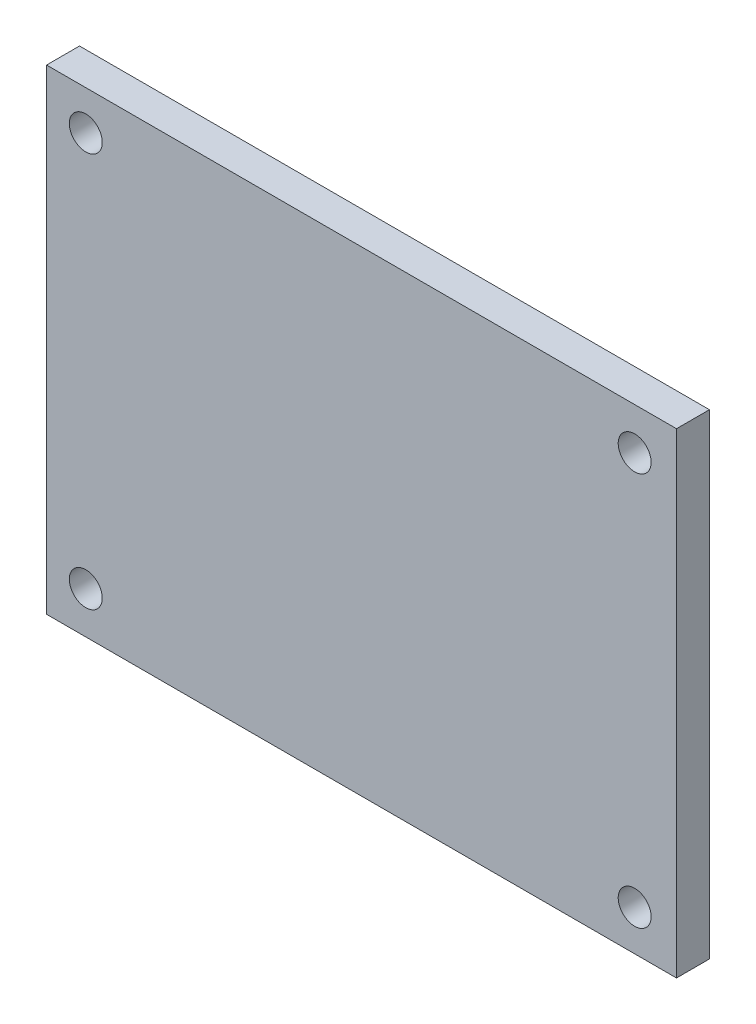
ISO-10303-21;
HEADER;
FILE_DESCRIPTION(('STEP AP214'),'2;1');
FILE_NAME('part.step','',(''),(''),'','','');
FILE_SCHEMA(('AUTOMOTIVE_DESIGN { 1 0 10303 214 1 1 1 1 }'));
ENDSEC;
DATA;
#1=APPLICATION_CONTEXT('core data for automotive mechanical design processes');
#2=APPLICATION_PROTOCOL_DEFINITION('international standard','automotive_design',2000,#1);
#3=PRODUCT_CONTEXT('',#1,'mechanical');
#4=PRODUCT('Part','Part','',(#3));
#5=PRODUCT_RELATED_PRODUCT_CATEGORY('part','',(#4));
#6=PRODUCT_DEFINITION_FORMATION('','',#4);
#7=PRODUCT_DEFINITION_CONTEXT('part definition',#1,'design');
#8=PRODUCT_DEFINITION('design','',#6,#7);
#9=PRODUCT_DEFINITION_SHAPE('','',#8);
#10=(LENGTH_UNIT() NAMED_UNIT(*) SI_UNIT(.MILLI.,.METRE.));
#11=(NAMED_UNIT(*) PLANE_ANGLE_UNIT() SI_UNIT($,.RADIAN.));
#12=(NAMED_UNIT(*) SI_UNIT($,.STERADIAN.) SOLID_ANGLE_UNIT());
#13=UNCERTAINTY_MEASURE_WITH_UNIT(LENGTH_MEASURE(1.E-05),#10,'distance_accuracy_value','');
#14=(GEOMETRIC_REPRESENTATION_CONTEXT(3) GLOBAL_UNCERTAINTY_ASSIGNED_CONTEXT((#13)) GLOBAL_UNIT_ASSIGNED_CONTEXT((#10,
#11,#12)) REPRESENTATION_CONTEXT('',''));
#15=CARTESIAN_POINT('',(0.,0.,0.));
#16=DIRECTION('',(0.,0.,1.));
#17=DIRECTION('',(1.,0.,0.));
#18=AXIS2_PLACEMENT_3D('',#15,#16,#17);
#19=CARTESIAN_POINT('',(0.,0.,3.2));
#20=DIRECTION('',(1.,0.,0.));
#21=DIRECTION('',(0.,0.,-1.));
#22=AXIS2_PLACEMENT_3D('',#19,#20,#21);
#23=PLANE('',#22);
#24=DIRECTION('',(0.,-1.,0.));
#25=VECTOR('',#24,1.);
#26=CARTESIAN_POINT('',(0.,0.,0.));
#27=LINE('',#26,#25);
#28=CARTESIAN_POINT('',(0.,46.228,0.));
#29=VERTEX_POINT('',#28);
#30=CARTESIAN_POINT('',(0.,0.,0.));
#31=VERTEX_POINT('',#30);
#32=EDGE_CURVE('E99',#29,#31,#27,.T.);
#33=ORIENTED_EDGE('',*,*,#32,.T.);
#34=DIRECTION('',(0.,0.,-1.));
#35=VECTOR('',#34,1.);
#36=CARTESIAN_POINT('',(0.,0.,3.2));
#37=LINE('',#36,#35);
#38=CARTESIAN_POINT('',(0.,0.,3.2));
#39=VERTEX_POINT('',#38);
#40=EDGE_CURVE('E11',#39,#31,#37,.T.);
#41=ORIENTED_EDGE('',*,*,#40,.F.);
#42=DIRECTION('',(0.,-1.,0.));
#43=VECTOR('',#42,1.);
#44=CARTESIAN_POINT('',(0.,0.,3.2));
#45=LINE('',#44,#43);
#46=CARTESIAN_POINT('',(0.,46.228,3.2));
#47=VERTEX_POINT('',#46);
#48=EDGE_CURVE('E87',#47,#39,#45,.T.);
#49=ORIENTED_EDGE('',*,*,#48,.F.);
#50=DIRECTION('',(0.,0.,-1.));
#51=VECTOR('',#50,1.);
#52=CARTESIAN_POINT('',(0.,46.228,3.2));
#53=LINE('',#52,#51);
#54=EDGE_CURVE('E95',#47,#29,#53,.T.);
#55=ORIENTED_EDGE('',*,*,#54,.T.);
#56=EDGE_LOOP('',(#33,#41,#49,#55));
#57=FACE_BOUND('',#56,.T.);
#58=ADVANCED_FACE('F36',(#57),#23,.F.);
#59=CARTESIAN_POINT('',(0.,0.,3.2));
#60=DIRECTION('',(0.,1.,0.));
#61=DIRECTION('',(0.,0.,1.));
#62=AXIS2_PLACEMENT_3D('',#59,#60,#61);
#63=PLANE('',#62);
#64=DIRECTION('',(1.,0.,0.));
#65=VECTOR('',#64,1.);
#66=CARTESIAN_POINT('',(0.,0.,0.));
#67=LINE('',#66,#65);
#68=CARTESIAN_POINT('',(61.214,0.,0.));
#69=VERTEX_POINT('',#68);
#70=EDGE_CURVE('E91',#31,#69,#67,.T.);
#71=ORIENTED_EDGE('',*,*,#70,.T.);
#72=DIRECTION('',(0.,0.,-1.));
#73=VECTOR('',#72,1.);
#74=CARTESIAN_POINT('',(61.214,0.,3.2));
#75=LINE('',#74,#73);
#76=CARTESIAN_POINT('',(61.214,0.,3.2));
#77=VERTEX_POINT('',#76);
#78=EDGE_CURVE('E44',#77,#69,#75,.T.);
#79=ORIENTED_EDGE('',*,*,#78,.F.);
#80=DIRECTION('',(1.,0.,0.));
#81=VECTOR('',#80,1.);
#82=CARTESIAN_POINT('',(0.,0.,3.2));
#83=LINE('',#82,#81);
#84=EDGE_CURVE('E82',#39,#77,#83,.T.);
#85=ORIENTED_EDGE('',*,*,#84,.F.);
#86=ORIENTED_EDGE('',*,*,#40,.T.);
#87=EDGE_LOOP('',(#71,#79,#85,#86));
#88=FACE_BOUND('',#87,.T.);
#89=ADVANCED_FACE('F90',(#88),#63,.F.);
#90=CARTESIAN_POINT('',(61.214,0.,3.2));
#91=DIRECTION('',(-1.,0.,0.));
#92=DIRECTION('',(0.,0.,1.));
#93=AXIS2_PLACEMENT_3D('',#90,#91,#92);
#94=PLANE('',#93);
#95=DIRECTION('',(0.,1.,0.));
#96=VECTOR('',#95,1.);
#97=CARTESIAN_POINT('',(61.214,0.,0.));
#98=LINE('',#97,#96);
#99=CARTESIAN_POINT('',(61.214,46.228,0.));
#100=VERTEX_POINT('',#99);
#101=EDGE_CURVE('E69',#69,#100,#98,.T.);
#102=ORIENTED_EDGE('',*,*,#101,.T.);
#103=DIRECTION('',(0.,0.,-1.));
#104=VECTOR('',#103,1.);
#105=CARTESIAN_POINT('',(61.214,46.228,3.2));
#106=LINE('',#105,#104);
#107=CARTESIAN_POINT('',(61.214,46.228,3.2));
#108=VERTEX_POINT('',#107);
#109=EDGE_CURVE('E92',#108,#100,#106,.T.);
#110=ORIENTED_EDGE('',*,*,#109,.F.);
#111=DIRECTION('',(0.,1.,0.));
#112=VECTOR('',#111,1.);
#113=CARTESIAN_POINT('',(61.214,0.,3.2));
#114=LINE('',#113,#112);
#115=EDGE_CURVE('E85',#77,#108,#114,.T.);
#116=ORIENTED_EDGE('',*,*,#115,.F.);
#117=ORIENTED_EDGE('',*,*,#78,.T.);
#118=EDGE_LOOP('',(#102,#110,#116,#117));
#119=FACE_BOUND('',#118,.T.);
#120=ADVANCED_FACE('F93',(#119),#94,.F.);
#121=CARTESIAN_POINT('',(0.,46.228,3.2));
#122=DIRECTION('',(0.,-1.,0.));
#123=DIRECTION('',(0.,0.,-1.));
#124=AXIS2_PLACEMENT_3D('',#121,#122,#123);
#125=PLANE('',#124);
#126=DIRECTION('',(-1.,0.,0.));
#127=VECTOR('',#126,1.);
#128=CARTESIAN_POINT('',(0.,46.228,0.));
#129=LINE('',#128,#127);
#130=EDGE_CURVE('E75',#100,#29,#129,.T.);
#131=ORIENTED_EDGE('',*,*,#130,.T.);
#132=ORIENTED_EDGE('',*,*,#54,.F.);
#133=DIRECTION('',(-1.,0.,0.));
#134=VECTOR('',#133,1.);
#135=CARTESIAN_POINT('',(0.,46.228,3.2));
#136=LINE('',#135,#134);
#137=EDGE_CURVE('E52',#108,#47,#136,.T.);
#138=ORIENTED_EDGE('',*,*,#137,.F.);
#139=ORIENTED_EDGE('',*,*,#109,.T.);
#140=EDGE_LOOP('',(#131,#132,#138,#139));
#141=FACE_BOUND('',#140,.T.);
#142=ADVANCED_FACE('F107',(#141),#125,.F.);
#143=CARTESIAN_POINT('',(0.,0.,3.2));
#144=DIRECTION('',(0.,0.,-1.));
#145=DIRECTION('',(-1.,0.,0.));
#146=AXIS2_PLACEMENT_3D('',#143,#144,#145);
#147=PLANE('',#146);
#148=CARTESIAN_POINT('',(57.15,3.92,3.2));
#149=DIRECTION('',(0.,0.,1.));
#150=DIRECTION('',(1.,0.,0.));
#151=AXIS2_PLACEMENT_3D('',#148,#149,#150);
#152=CIRCLE('',#151,1.60000000000001);
#153=CARTESIAN_POINT('',(58.75,3.92,3.2));
#154=VERTEX_POINT('',#153);
#155=EDGE_CURVE('E123',#154,#154,#152,.T.);
#156=ORIENTED_EDGE('',*,*,#155,.F.);
#157=EDGE_LOOP('',(#156));
#158=FACE_BOUND('',#157,.T.);
#159=CARTESIAN_POINT('',(57.15,42.164,3.2));
#160=DIRECTION('',(0.,0.,1.));
#161=DIRECTION('',(1.,0.,0.));
#162=AXIS2_PLACEMENT_3D('',#159,#160,#161);
#163=CIRCLE('',#162,1.60000000000001);
#164=CARTESIAN_POINT('',(58.75,42.164,3.2));
#165=VERTEX_POINT('',#164);
#166=EDGE_CURVE('E122',#165,#165,#163,.T.);
#167=ORIENTED_EDGE('',*,*,#166,.F.);
#168=EDGE_LOOP('',(#167));
#169=FACE_BOUND('',#168,.T.);
#170=CARTESIAN_POINT('',(3.81,42.418,3.2));
#171=DIRECTION('',(0.,0.,1.));
#172=DIRECTION('',(1.,0.,0.));
#173=AXIS2_PLACEMENT_3D('',#170,#171,#172);
#174=CIRCLE('',#173,1.6);
#175=CARTESIAN_POINT('',(5.41,42.418,3.2));
#176=VERTEX_POINT('',#175);
#177=EDGE_CURVE('E129',#176,#176,#174,.T.);
#178=ORIENTED_EDGE('',*,*,#177,.F.);
#179=EDGE_LOOP('',(#178));
#180=FACE_BOUND('',#179,.T.);
#181=CARTESIAN_POINT('',(3.81,4.064,3.2));
#182=DIRECTION('',(0.,0.,1.));
#183=DIRECTION('',(1.,0.,0.));
#184=AXIS2_PLACEMENT_3D('',#181,#182,#183);
#185=CIRCLE('',#184,1.6);
#186=CARTESIAN_POINT('',(5.41,4.064,3.2));
#187=VERTEX_POINT('',#186);
#188=EDGE_CURVE('E115',#187,#187,#185,.T.);
#189=ORIENTED_EDGE('',*,*,#188,.F.);
#190=EDGE_LOOP('',(#189));
#191=FACE_BOUND('',#190,.T.);
#192=ORIENTED_EDGE('',*,*,#48,.T.);
#193=ORIENTED_EDGE('',*,*,#84,.T.);
#194=ORIENTED_EDGE('',*,*,#115,.T.);
#195=ORIENTED_EDGE('',*,*,#137,.T.);
#196=EDGE_LOOP('',(#192,#193,#194,#195));
#197=FACE_BOUND('',#196,.T.);
#198=ADVANCED_FACE('F83',(#158,#169,#180,#191,#197),#147,.F.);
#199=CARTESIAN_POINT('',(0.,0.,0.));
#200=DIRECTION('',(0.,0.,-1.));
#201=DIRECTION('',(-1.,0.,0.));
#202=AXIS2_PLACEMENT_3D('',#199,#200,#201);
#203=PLANE('',#202);
#204=CARTESIAN_POINT('',(57.15,3.92,0.));
#205=DIRECTION('',(0.,0.,-1.));
#206=DIRECTION('',(-1.,0.,0.));
#207=AXIS2_PLACEMENT_3D('',#204,#205,#206);
#208=CIRCLE('',#207,1.60000000000001);
#209=CARTESIAN_POINT('',(55.55,3.92,0.));
#210=VERTEX_POINT('',#209);
#211=EDGE_CURVE('E119',#210,#210,#208,.F.);
#212=ORIENTED_EDGE('',*,*,#211,.T.);
#213=EDGE_LOOP('',(#212));
#214=FACE_BOUND('',#213,.T.);
#215=CARTESIAN_POINT('',(57.15,42.164,0.));
#216=DIRECTION('',(0.,0.,-1.));
#217=DIRECTION('',(-1.,0.,0.));
#218=AXIS2_PLACEMENT_3D('',#215,#216,#217);
#219=CIRCLE('',#218,1.60000000000001);
#220=CARTESIAN_POINT('',(55.55,42.164,0.));
#221=VERTEX_POINT('',#220);
#222=EDGE_CURVE('E126',#221,#221,#219,.F.);
#223=ORIENTED_EDGE('',*,*,#222,.T.);
#224=EDGE_LOOP('',(#223));
#225=FACE_BOUND('',#224,.T.);
#226=CARTESIAN_POINT('',(3.81,42.418,0.));
#227=DIRECTION('',(0.,0.,-1.));
#228=DIRECTION('',(-1.,0.,0.));
#229=AXIS2_PLACEMENT_3D('',#226,#227,#228);
#230=CIRCLE('',#229,1.6);
#231=CARTESIAN_POINT('',(2.21,42.418,0.));
#232=VERTEX_POINT('',#231);
#233=EDGE_CURVE('E118',#232,#232,#230,.F.);
#234=ORIENTED_EDGE('',*,*,#233,.T.);
#235=EDGE_LOOP('',(#234));
#236=FACE_BOUND('',#235,.T.);
#237=CARTESIAN_POINT('',(3.81,4.064,0.));
#238=DIRECTION('',(0.,0.,-1.));
#239=DIRECTION('',(-1.,0.,0.));
#240=AXIS2_PLACEMENT_3D('',#237,#238,#239);
#241=CIRCLE('',#240,1.6);
#242=CARTESIAN_POINT('',(2.21,4.064,0.));
#243=VERTEX_POINT('',#242);
#244=EDGE_CURVE('E102',#243,#243,#241,.F.);
#245=ORIENTED_EDGE('',*,*,#244,.T.);
#246=EDGE_LOOP('',(#245));
#247=FACE_BOUND('',#246,.T.);
#248=ORIENTED_EDGE('',*,*,#32,.F.);
#249=ORIENTED_EDGE('',*,*,#130,.F.);
#250=ORIENTED_EDGE('',*,*,#101,.F.);
#251=ORIENTED_EDGE('',*,*,#70,.F.);
#252=EDGE_LOOP('',(#248,#249,#250,#251));
#253=FACE_BOUND('',#252,.T.);
#254=ADVANCED_FACE('F110',(#214,#225,#236,#247,#253),#203,.T.);
#255=CARTESIAN_POINT('',(3.81,4.064,-4.52548339959392));
#256=DIRECTION('',(0.,0.,1.));
#257=DIRECTION('',(1.,0.,0.));
#258=AXIS2_PLACEMENT_3D('',#255,#256,#257);
#259=CYLINDRICAL_SURFACE('',#258,1.6);
#260=ORIENTED_EDGE('',*,*,#188,.T.);
#261=EDGE_LOOP('',(#260));
#262=FACE_BOUND('',#261,.T.);
#263=ORIENTED_EDGE('',*,*,#244,.F.);
#264=EDGE_LOOP('',(#263));
#265=FACE_BOUND('',#264,.T.);
#266=ADVANCED_FACE('F146',(#262,#265),#259,.F.);
#267=CARTESIAN_POINT('',(3.81,42.418,-4.52548339959392));
#268=DIRECTION('',(0.,0.,1.));
#269=DIRECTION('',(1.,0.,0.));
#270=AXIS2_PLACEMENT_3D('',#267,#268,#269);
#271=CYLINDRICAL_SURFACE('',#270,1.6);
#272=ORIENTED_EDGE('',*,*,#177,.T.);
#273=EDGE_LOOP('',(#272));
#274=FACE_BOUND('',#273,.T.);
#275=ORIENTED_EDGE('',*,*,#233,.F.);
#276=EDGE_LOOP('',(#275));
#277=FACE_BOUND('',#276,.T.);
#278=ADVANCED_FACE('F137',(#274,#277),#271,.F.);
#279=CARTESIAN_POINT('',(57.15,42.164,-4.52548339959392));
#280=DIRECTION('',(0.,0.,1.));
#281=DIRECTION('',(1.,0.,0.));
#282=AXIS2_PLACEMENT_3D('',#279,#280,#281);
#283=CYLINDRICAL_SURFACE('',#282,1.60000000000001);
#284=ORIENTED_EDGE('',*,*,#166,.T.);
#285=EDGE_LOOP('',(#284));
#286=FACE_BOUND('',#285,.T.);
#287=ORIENTED_EDGE('',*,*,#222,.F.);
#288=EDGE_LOOP('',(#287));
#289=FACE_BOUND('',#288,.T.);
#290=ADVANCED_FACE('F195',(#286,#289),#283,.F.);
#291=CARTESIAN_POINT('',(57.15,3.92,-4.52548339959392));
#292=DIRECTION('',(0.,0.,1.));
#293=DIRECTION('',(1.,0.,0.));
#294=AXIS2_PLACEMENT_3D('',#291,#292,#293);
#295=CYLINDRICAL_SURFACE('',#294,1.60000000000001);
#296=ORIENTED_EDGE('',*,*,#155,.T.);
#297=EDGE_LOOP('',(#296));
#298=FACE_BOUND('',#297,.T.);
#299=ORIENTED_EDGE('',*,*,#211,.F.);
#300=EDGE_LOOP('',(#299));
#301=FACE_BOUND('',#300,.T.);
#302=ADVANCED_FACE('F204',(#298,#301),#295,.F.);
#303=CLOSED_SHELL('',(#58,#89,#120,#142,#198,#254,#266,#278,#290,#302));
#304=MANIFOLD_SOLID_BREP('B2',#303);
#305=ADVANCED_BREP_SHAPE_REPRESENTATION('',(#18,#304),#14);
#306=SHAPE_DEFINITION_REPRESENTATION(#9,#305);
ENDSEC;
END-ISO-10303-21;
